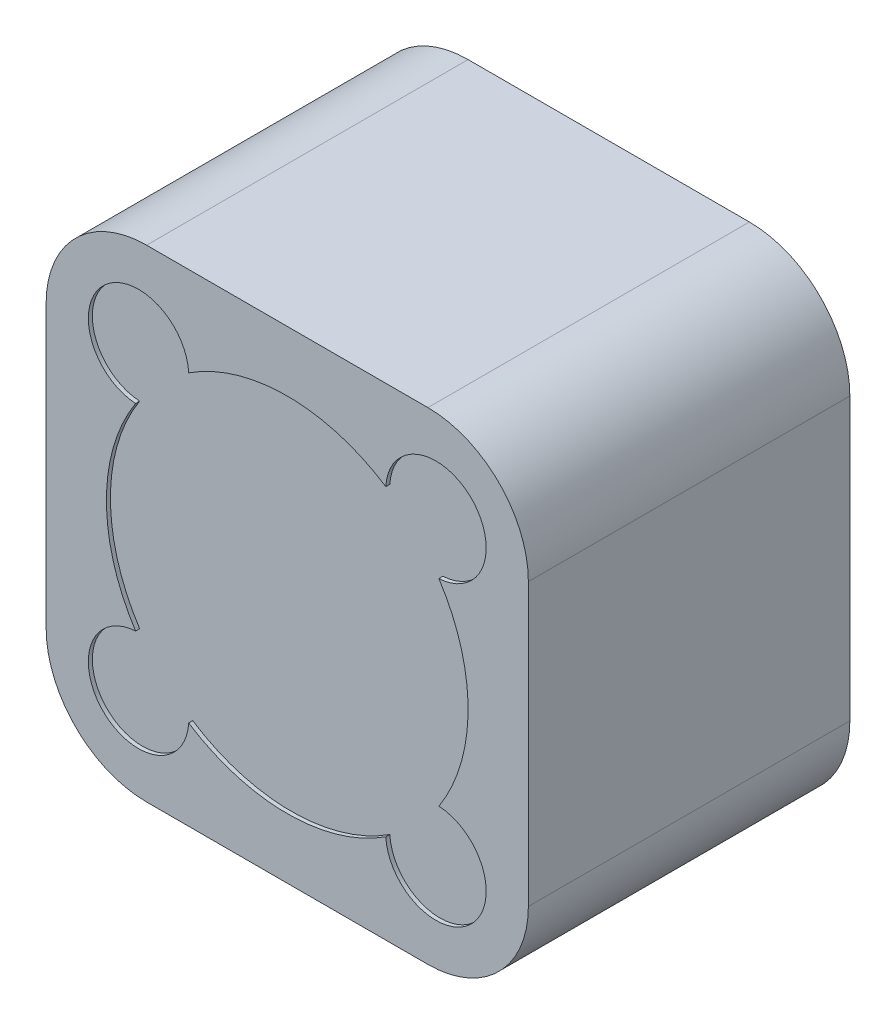
ISO-10303-21;
HEADER;
FILE_DESCRIPTION(('STEP AP214'),'2;1');
FILE_NAME('part.step','',(''),(''),'','','');
FILE_SCHEMA(('AUTOMOTIVE_DESIGN { 1 0 10303 214 1 1 1 1 }'));
ENDSEC;
DATA;
#1=APPLICATION_CONTEXT('core data for automotive mechanical design processes');
#2=APPLICATION_PROTOCOL_DEFINITION('international standard','automotive_design',2000,#1);
#3=PRODUCT_CONTEXT('',#1,'mechanical');
#4=PRODUCT('Part','Part','',(#3));
#5=PRODUCT_RELATED_PRODUCT_CATEGORY('part','',(#4));
#6=PRODUCT_DEFINITION_FORMATION('','',#4);
#7=PRODUCT_DEFINITION_CONTEXT('part definition',#1,'design');
#8=PRODUCT_DEFINITION('design','',#6,#7);
#9=PRODUCT_DEFINITION_SHAPE('','',#8);
#10=(LENGTH_UNIT() NAMED_UNIT(*) SI_UNIT(.MILLI.,.METRE.));
#11=(NAMED_UNIT(*) PLANE_ANGLE_UNIT() SI_UNIT($,.RADIAN.));
#12=(NAMED_UNIT(*) SI_UNIT($,.STERADIAN.) SOLID_ANGLE_UNIT());
#13=UNCERTAINTY_MEASURE_WITH_UNIT(LENGTH_MEASURE(1.E-05),#10,'distance_accuracy_value','');
#14=(GEOMETRIC_REPRESENTATION_CONTEXT(3) GLOBAL_UNCERTAINTY_ASSIGNED_CONTEXT((#13)) GLOBAL_UNIT_ASSIGNED_CONTEXT((#10,
#11,#12)) REPRESENTATION_CONTEXT('',''));
#15=CARTESIAN_POINT('',(0.,0.,0.));
#16=DIRECTION('',(0.,0.,1.));
#17=DIRECTION('',(1.,0.,0.));
#18=AXIS2_PLACEMENT_3D('',#15,#16,#17);
#19=CARTESIAN_POINT('',(0.,0.,7.9));
#20=DIRECTION('',(0.,0.,1.));
#21=DIRECTION('',(1.,0.,0.));
#22=AXIS2_PLACEMENT_3D('',#19,#20,#21);
#23=CYLINDRICAL_SURFACE('',#22,4.5);
#24=CARTESIAN_POINT('',(0.,0.,7.9));
#25=DIRECTION('',(0.,0.,1.));
#26=DIRECTION('',(1.,0.,0.));
#27=AXIS2_PLACEMENT_3D('',#24,#25,#26);
#28=CIRCLE('',#27,4.5);
#29=CARTESIAN_POINT('',(3.77319310560411,-2.45214473223372,7.9));
#30=VERTEX_POINT('',#29);
#31=CARTESIAN_POINT('',(3.77319310560411,2.45214473223373,7.9));
#32=VERTEX_POINT('',#31);
#33=EDGE_CURVE('E165',#30,#32,#28,.T.);
#34=ORIENTED_EDGE('',*,*,#33,.F.);
#35=DIRECTION('',(0.,0.,1.));
#36=VECTOR('',#35,1.);
#37=CARTESIAN_POINT('',(3.77319310560411,-2.45214473223372,7.95));
#38=LINE('',#37,#36);
#39=CARTESIAN_POINT('',(3.77319310560411,-2.45214473223372,8.));
#40=VERTEX_POINT('',#39);
#41=EDGE_CURVE('E313',#30,#40,#38,.T.);
#42=ORIENTED_EDGE('',*,*,#41,.T.);
#43=CARTESIAN_POINT('',(0.,0.,8.));
#44=DIRECTION('',(0.,0.,1.));
#45=DIRECTION('',(1.,0.,0.));
#46=AXIS2_PLACEMENT_3D('',#43,#44,#45);
#47=CIRCLE('',#46,4.5);
#48=CARTESIAN_POINT('',(3.77319310560411,2.45214473223373,8.));
#49=VERTEX_POINT('',#48);
#50=EDGE_CURVE('E177',#40,#49,#47,.T.);
#51=ORIENTED_EDGE('',*,*,#50,.T.);
#52=DIRECTION('',(0.,0.,1.));
#53=VECTOR('',#52,1.);
#54=CARTESIAN_POINT('',(3.77319310560411,2.45214473223373,7.95));
#55=LINE('',#54,#53);
#56=EDGE_CURVE('E323',#49,#32,#55,.F.);
#57=ORIENTED_EDGE('',*,*,#56,.T.);
#58=EDGE_LOOP('',(#34,#42,#51,#57));
#59=FACE_BOUND('',#58,.T.);
#60=ADVANCED_FACE('F33',(#59),#23,.F.);
#61=CARTESIAN_POINT('',(2.45214473223373,3.77319310560411,7.9));
#62=VERTEX_POINT('',#61);
#63=CARTESIAN_POINT('',(-2.45214473223377,3.77319310560408,7.9));
#64=VERTEX_POINT('',#63);
#65=EDGE_CURVE('E158',#62,#64,#28,.T.);
#66=ORIENTED_EDGE('',*,*,#65,.F.);
#67=DIRECTION('',(0.,0.,1.));
#68=VECTOR('',#67,1.);
#69=CARTESIAN_POINT('',(2.45214473223373,3.77319310560411,7.95));
#70=LINE('',#69,#68);
#71=CARTESIAN_POINT('',(2.45214473223373,3.77319310560411,8.));
#72=VERTEX_POINT('',#71);
#73=EDGE_CURVE('E321',#62,#72,#70,.T.);
#74=ORIENTED_EDGE('',*,*,#73,.T.);
#75=CARTESIAN_POINT('',(-2.45214473223377,3.77319310560408,8.));
#76=VERTEX_POINT('',#75);
#77=EDGE_CURVE('E160',#72,#76,#47,.T.);
#78=ORIENTED_EDGE('',*,*,#77,.T.);
#79=DIRECTION('',(0.,0.,1.));
#80=VECTOR('',#79,1.);
#81=CARTESIAN_POINT('',(-2.45214473223377,3.77319310560408,7.95));
#82=LINE('',#81,#80);
#83=EDGE_CURVE('E145',#76,#64,#82,.F.);
#84=ORIENTED_EDGE('',*,*,#83,.T.);
#85=EDGE_LOOP('',(#66,#74,#78,#84));
#86=FACE_BOUND('',#85,.T.);
#87=ADVANCED_FACE('F156',(#86),#23,.F.);
#88=CARTESIAN_POINT('',(-3.77319310560413,2.45214473223369,7.9));
#89=VERTEX_POINT('',#88);
#90=CARTESIAN_POINT('',(-3.77319310560411,-2.45214473223373,7.9));
#91=VERTEX_POINT('',#90);
#92=EDGE_CURVE('E166',#89,#91,#28,.T.);
#93=ORIENTED_EDGE('',*,*,#92,.F.);
#94=DIRECTION('',(0.,0.,1.));
#95=VECTOR('',#94,1.);
#96=CARTESIAN_POINT('',(-3.77319310560413,2.45214473223369,7.95));
#97=LINE('',#96,#95);
#98=CARTESIAN_POINT('',(-3.77319310560413,2.45214473223369,8.));
#99=VERTEX_POINT('',#98);
#100=EDGE_CURVE('E148',#89,#99,#97,.T.);
#101=ORIENTED_EDGE('',*,*,#100,.T.);
#102=CARTESIAN_POINT('',(-3.77319310560411,-2.45214473223373,8.));
#103=VERTEX_POINT('',#102);
#104=EDGE_CURVE('E178',#99,#103,#47,.T.);
#105=ORIENTED_EDGE('',*,*,#104,.T.);
#106=DIRECTION('',(0.,0.,1.));
#107=VECTOR('',#106,1.);
#108=CARTESIAN_POINT('',(-3.77319310560411,-2.45214473223373,7.95));
#109=LINE('',#108,#107);
#110=EDGE_CURVE('E303',#103,#91,#109,.F.);
#111=ORIENTED_EDGE('',*,*,#110,.T.);
#112=EDGE_LOOP('',(#93,#101,#105,#111));
#113=FACE_BOUND('',#112,.T.);
#114=ADVANCED_FACE('F284',(#113),#23,.F.);
#115=CARTESIAN_POINT('',(6.,-6.,8.));
#116=DIRECTION('',(-1.,0.,0.));
#117=DIRECTION('',(0.,0.,1.));
#118=AXIS2_PLACEMENT_3D('',#115,#116,#117);
#119=PLANE('',#118);
#120=DIRECTION('',(0.,1.,0.));
#121=VECTOR('',#120,1.);
#122=CARTESIAN_POINT('',(6.,-6.,0.));
#123=LINE('',#122,#121);
#124=CARTESIAN_POINT('',(6.,-3.5,0.));
#125=VERTEX_POINT('',#124);
#126=CARTESIAN_POINT('',(6.,3.5,0.));
#127=VERTEX_POINT('',#126);
#128=EDGE_CURVE('E172',#125,#127,#123,.T.);
#129=ORIENTED_EDGE('',*,*,#128,.T.);
#130=DIRECTION('',(0.,0.,-1.));
#131=VECTOR('',#130,1.);
#132=CARTESIAN_POINT('',(6.,3.5,8.));
#133=LINE('',#132,#131);
#134=CARTESIAN_POINT('',(6.,3.5,8.));
#135=VERTEX_POINT('',#134);
#136=EDGE_CURVE('E231',#127,#135,#133,.F.);
#137=ORIENTED_EDGE('',*,*,#136,.T.);
#138=DIRECTION('',(0.,1.,0.));
#139=VECTOR('',#138,1.);
#140=CARTESIAN_POINT('',(6.,-6.,8.));
#141=LINE('',#140,#139);
#142=CARTESIAN_POINT('',(6.,-3.5,8.));
#143=VERTEX_POINT('',#142);
#144=EDGE_CURVE('E179',#143,#135,#141,.T.);
#145=ORIENTED_EDGE('',*,*,#144,.F.);
#146=DIRECTION('',(0.,0.,-1.));
#147=VECTOR('',#146,1.);
#148=CARTESIAN_POINT('',(6.,-3.5,8.));
#149=LINE('',#148,#147);
#150=EDGE_CURVE('E228',#143,#125,#149,.T.);
#151=ORIENTED_EDGE('',*,*,#150,.T.);
#152=EDGE_LOOP('',(#129,#137,#145,#151));
#153=FACE_BOUND('',#152,.T.);
#154=ADVANCED_FACE('F247',(#153),#119,.F.);
#155=CARTESIAN_POINT('',(-6.,6.,8.));
#156=DIRECTION('',(0.,-1.,0.));
#157=DIRECTION('',(0.,0.,-1.));
#158=AXIS2_PLACEMENT_3D('',#155,#156,#157);
#159=PLANE('',#158);
#160=DIRECTION('',(-1.,0.,0.));
#161=VECTOR('',#160,1.);
#162=CARTESIAN_POINT('',(-6.,6.,0.));
#163=LINE('',#162,#161);
#164=CARTESIAN_POINT('',(3.5,6.,0.));
#165=VERTEX_POINT('',#164);
#166=CARTESIAN_POINT('',(-3.5,6.,0.));
#167=VERTEX_POINT('',#166);
#168=EDGE_CURVE('E195',#165,#167,#163,.T.);
#169=ORIENTED_EDGE('',*,*,#168,.T.);
#170=DIRECTION('',(0.,0.,-1.));
#171=VECTOR('',#170,1.);
#172=CARTESIAN_POINT('',(-3.5,6.,8.));
#173=LINE('',#172,#171);
#174=CARTESIAN_POINT('',(-3.5,6.,8.));
#175=VERTEX_POINT('',#174);
#176=EDGE_CURVE('E218',#167,#175,#173,.F.);
#177=ORIENTED_EDGE('',*,*,#176,.T.);
#178=DIRECTION('',(-1.,0.,0.));
#179=VECTOR('',#178,1.);
#180=CARTESIAN_POINT('',(-6.,6.,8.));
#181=LINE('',#180,#179);
#182=CARTESIAN_POINT('',(3.5,6.,8.));
#183=VERTEX_POINT('',#182);
#184=EDGE_CURVE('E182',#183,#175,#181,.T.);
#185=ORIENTED_EDGE('',*,*,#184,.F.);
#186=DIRECTION('',(0.,0.,-1.));
#187=VECTOR('',#186,1.);
#188=CARTESIAN_POINT('',(3.5,6.,8.));
#189=LINE('',#188,#187);
#190=EDGE_CURVE('E215',#183,#165,#189,.T.);
#191=ORIENTED_EDGE('',*,*,#190,.T.);
#192=EDGE_LOOP('',(#169,#177,#185,#191));
#193=FACE_BOUND('',#192,.T.);
#194=ADVANCED_FACE('F259',(#193),#159,.F.);
#195=CARTESIAN_POINT('',(-6.,-6.,8.));
#196=DIRECTION('',(1.,0.,0.));
#197=DIRECTION('',(0.,0.,-1.));
#198=AXIS2_PLACEMENT_3D('',#195,#196,#197);
#199=PLANE('',#198);
#200=DIRECTION('',(0.,-1.,0.));
#201=VECTOR('',#200,1.);
#202=CARTESIAN_POINT('',(-6.,-6.,8.));
#203=LINE('',#202,#201);
#204=CARTESIAN_POINT('',(-6.,3.5,8.));
#205=VERTEX_POINT('',#204);
#206=CARTESIAN_POINT('',(-6.,-3.5,8.));
#207=VERTEX_POINT('',#206);
#208=EDGE_CURVE('E186',#205,#207,#203,.T.);
#209=ORIENTED_EDGE('',*,*,#208,.F.);
#210=DIRECTION('',(0.,0.,-1.));
#211=VECTOR('',#210,1.);
#212=CARTESIAN_POINT('',(-6.,3.5,8.));
#213=LINE('',#212,#211);
#214=CARTESIAN_POINT('',(-6.,3.5,0.));
#215=VERTEX_POINT('',#214);
#216=EDGE_CURVE('E204',#205,#215,#213,.T.);
#217=ORIENTED_EDGE('',*,*,#216,.T.);
#218=DIRECTION('',(0.,-1.,0.));
#219=VECTOR('',#218,1.);
#220=CARTESIAN_POINT('',(-6.,-6.,0.));
#221=LINE('',#220,#219);
#222=CARTESIAN_POINT('',(-6.,-3.5,0.));
#223=VERTEX_POINT('',#222);
#224=EDGE_CURVE('E198',#215,#223,#221,.T.);
#225=ORIENTED_EDGE('',*,*,#224,.T.);
#226=DIRECTION('',(0.,0.,-1.));
#227=VECTOR('',#226,1.);
#228=CARTESIAN_POINT('',(-6.,-3.5,8.));
#229=LINE('',#228,#227);
#230=EDGE_CURVE('E192',#223,#207,#229,.F.);
#231=ORIENTED_EDGE('',*,*,#230,.T.);
#232=EDGE_LOOP('',(#209,#217,#225,#231));
#233=FACE_BOUND('',#232,.T.);
#234=ADVANCED_FACE('F267',(#233),#199,.F.);
#235=CARTESIAN_POINT('',(-6.,-6.,8.));
#236=DIRECTION('',(0.,1.,0.));
#237=DIRECTION('',(0.,0.,1.));
#238=AXIS2_PLACEMENT_3D('',#235,#236,#237);
#239=PLANE('',#238);
#240=DIRECTION('',(1.,0.,0.));
#241=VECTOR('',#240,1.);
#242=CARTESIAN_POINT('',(-6.,-6.,8.));
#243=LINE('',#242,#241);
#244=CARTESIAN_POINT('',(-3.5,-6.,8.));
#245=VERTEX_POINT('',#244);
#246=CARTESIAN_POINT('',(3.5,-6.,8.));
#247=VERTEX_POINT('',#246);
#248=EDGE_CURVE('E189',#245,#247,#243,.T.);
#249=ORIENTED_EDGE('',*,*,#248,.F.);
#250=DIRECTION('',(0.,0.,-1.));
#251=VECTOR('',#250,1.);
#252=CARTESIAN_POINT('',(-3.5,-6.,8.));
#253=LINE('',#252,#251);
#254=CARTESIAN_POINT('',(-3.5,-6.,0.));
#255=VERTEX_POINT('',#254);
#256=EDGE_CURVE('E11',#245,#255,#253,.T.);
#257=ORIENTED_EDGE('',*,*,#256,.T.);
#258=DIRECTION('',(1.,0.,0.));
#259=VECTOR('',#258,1.);
#260=CARTESIAN_POINT('',(-6.,-6.,0.));
#261=LINE('',#260,#259);
#262=CARTESIAN_POINT('',(3.5,-6.,0.));
#263=VERTEX_POINT('',#262);
#264=EDGE_CURVE('E183',#255,#263,#261,.T.);
#265=ORIENTED_EDGE('',*,*,#264,.T.);
#266=DIRECTION('',(0.,0.,-1.));
#267=VECTOR('',#266,1.);
#268=CARTESIAN_POINT('',(3.5,-6.,8.));
#269=LINE('',#268,#267);
#270=EDGE_CURVE('E41',#263,#247,#269,.F.);
#271=ORIENTED_EDGE('',*,*,#270,.T.);
#272=EDGE_LOOP('',(#249,#257,#265,#271));
#273=FACE_BOUND('',#272,.T.);
#274=ADVANCED_FACE('F235',(#273),#239,.F.);
#275=CARTESIAN_POINT('',(0.,0.,8.));
#276=DIRECTION('',(0.,0.,-1.));
#277=DIRECTION('',(-1.,0.,0.));
#278=AXIS2_PLACEMENT_3D('',#275,#276,#277);
#279=PLANE('',#278);
#280=ORIENTED_EDGE('',*,*,#50,.F.);
#281=CARTESIAN_POINT('',(3.70000000000001,-3.69999999999999,8.));
#282=DIRECTION('',(0.,0.,1.));
#283=DIRECTION('',(0.,1.,0.));
#284=AXIS2_PLACEMENT_3D('',#281,#282,#283);
#285=CIRCLE('',#284,1.25);
#286=CARTESIAN_POINT('',(2.45214473223374,-3.7731931056041,8.));
#287=VERTEX_POINT('',#286);
#288=EDGE_CURVE('E330',#287,#40,#285,.T.);
#289=ORIENTED_EDGE('',*,*,#288,.F.);
#290=CARTESIAN_POINT('',(-2.45214473223373,-3.77319310560411,8.));
#291=VERTEX_POINT('',#290);
#292=EDGE_CURVE('E169',#291,#287,#47,.T.);
#293=ORIENTED_EDGE('',*,*,#292,.F.);
#294=CARTESIAN_POINT('',(-3.7,-3.7,8.));
#295=DIRECTION('',(0.,0.,1.));
#296=DIRECTION('',(1.,0.,0.));
#297=AXIS2_PLACEMENT_3D('',#294,#295,#296);
#298=CIRCLE('',#297,1.25);
#299=EDGE_CURVE('E311',#103,#291,#298,.T.);
#300=ORIENTED_EDGE('',*,*,#299,.F.);
#301=ORIENTED_EDGE('',*,*,#104,.F.);
#302=CARTESIAN_POINT('',(-3.70000000000004,3.69999999999996,8.));
#303=DIRECTION('',(0.,0.,1.));
#304=DIRECTION('',(0.,-1.,0.));
#305=AXIS2_PLACEMENT_3D('',#302,#303,#304);
#306=CIRCLE('',#305,1.25);
#307=EDGE_CURVE('E151',#76,#99,#306,.T.);
#308=ORIENTED_EDGE('',*,*,#307,.F.);
#309=ORIENTED_EDGE('',*,*,#77,.F.);
#310=CARTESIAN_POINT('',(3.7,3.7,8.));
#311=DIRECTION('',(0.,0.,1.));
#312=DIRECTION('',(-1.,0.,0.));
#313=AXIS2_PLACEMENT_3D('',#310,#311,#312);
#314=CIRCLE('',#313,1.25);
#315=EDGE_CURVE('E150',#49,#72,#314,.T.);
#316=ORIENTED_EDGE('',*,*,#315,.F.);
#317=EDGE_LOOP('',(#280,#289,#293,#300,#301,#308,#309,#316));
#318=FACE_BOUND('',#317,.T.);
#319=ORIENTED_EDGE('',*,*,#184,.T.);
#320=CARTESIAN_POINT('',(-3.5,3.5,8.));
#321=DIRECTION('',(0.,0.,-1.));
#322=DIRECTION('',(-1.,0.,0.));
#323=AXIS2_PLACEMENT_3D('',#320,#321,#322);
#324=CIRCLE('',#323,2.5);
#325=EDGE_CURVE('E226',#175,#205,#324,.F.);
#326=ORIENTED_EDGE('',*,*,#325,.T.);
#327=ORIENTED_EDGE('',*,*,#208,.T.);
#328=CARTESIAN_POINT('',(-3.5,-3.5,8.));
#329=DIRECTION('',(0.,0.,-1.));
#330=DIRECTION('',(-1.,0.,0.));
#331=AXIS2_PLACEMENT_3D('',#328,#329,#330);
#332=CIRCLE('',#331,2.5);
#333=EDGE_CURVE('E222',#207,#245,#332,.F.);
#334=ORIENTED_EDGE('',*,*,#333,.T.);
#335=ORIENTED_EDGE('',*,*,#248,.T.);
#336=CARTESIAN_POINT('',(3.5,-3.5,8.));
#337=DIRECTION('',(0.,0.,-1.));
#338=DIRECTION('',(-1.,0.,0.));
#339=AXIS2_PLACEMENT_3D('',#336,#337,#338);
#340=CIRCLE('',#339,2.5);
#341=EDGE_CURVE('E220',#247,#143,#340,.F.);
#342=ORIENTED_EDGE('',*,*,#341,.T.);
#343=ORIENTED_EDGE('',*,*,#144,.T.);
#344=CARTESIAN_POINT('',(3.5,3.5,8.));
#345=DIRECTION('',(0.,0.,-1.));
#346=DIRECTION('',(-1.,0.,0.));
#347=AXIS2_PLACEMENT_3D('',#344,#345,#346);
#348=CIRCLE('',#347,2.5);
#349=EDGE_CURVE('E224',#135,#183,#348,.F.);
#350=ORIENTED_EDGE('',*,*,#349,.T.);
#351=EDGE_LOOP('',(#319,#326,#327,#334,#335,#342,#343,#350));
#352=FACE_BOUND('',#351,.T.);
#353=ADVANCED_FACE('F241',(#318,#352),#279,.F.);
#354=CARTESIAN_POINT('',(0.,0.,0.));
#355=DIRECTION('',(0.,0.,-1.));
#356=DIRECTION('',(-1.,0.,0.));
#357=AXIS2_PLACEMENT_3D('',#354,#355,#356);
#358=PLANE('',#357);
#359=ORIENTED_EDGE('',*,*,#224,.F.);
#360=CARTESIAN_POINT('',(-3.5,3.5,0.));
#361=DIRECTION('',(0.,0.,-1.));
#362=DIRECTION('',(-1.,0.,0.));
#363=AXIS2_PLACEMENT_3D('',#360,#361,#362);
#364=CIRCLE('',#363,2.5);
#365=EDGE_CURVE('E213',#215,#167,#364,.T.);
#366=ORIENTED_EDGE('',*,*,#365,.T.);
#367=ORIENTED_EDGE('',*,*,#168,.F.);
#368=CARTESIAN_POINT('',(3.5,3.5,0.));
#369=DIRECTION('',(0.,0.,-1.));
#370=DIRECTION('',(-1.,0.,0.));
#371=AXIS2_PLACEMENT_3D('',#368,#369,#370);
#372=CIRCLE('',#371,2.5);
#373=EDGE_CURVE('E211',#165,#127,#372,.T.);
#374=ORIENTED_EDGE('',*,*,#373,.T.);
#375=ORIENTED_EDGE('',*,*,#128,.F.);
#376=CARTESIAN_POINT('',(3.5,-3.5,0.));
#377=DIRECTION('',(0.,0.,-1.));
#378=DIRECTION('',(-1.,0.,0.));
#379=AXIS2_PLACEMENT_3D('',#376,#377,#378);
#380=CIRCLE('',#379,2.5);
#381=EDGE_CURVE('E207',#125,#263,#380,.T.);
#382=ORIENTED_EDGE('',*,*,#381,.T.);
#383=ORIENTED_EDGE('',*,*,#264,.F.);
#384=CARTESIAN_POINT('',(-3.5,-3.5,0.));
#385=DIRECTION('',(0.,0.,-1.));
#386=DIRECTION('',(-1.,0.,0.));
#387=AXIS2_PLACEMENT_3D('',#384,#385,#386);
#388=CIRCLE('',#387,2.5);
#389=EDGE_CURVE('E209',#255,#223,#388,.T.);
#390=ORIENTED_EDGE('',*,*,#389,.T.);
#391=EDGE_LOOP('',(#359,#366,#367,#374,#375,#382,#383,#390));
#392=FACE_BOUND('',#391,.T.);
#393=ADVANCED_FACE('F251',(#392),#358,.T.);
#394=CARTESIAN_POINT('',(-3.5,3.5,8.));
#395=DIRECTION('',(0.,0.,-1.));
#396=DIRECTION('',(-1.,0.,0.));
#397=AXIS2_PLACEMENT_3D('',#394,#395,#396);
#398=CYLINDRICAL_SURFACE('',#397,2.5);
#399=ORIENTED_EDGE('',*,*,#325,.F.);
#400=ORIENTED_EDGE('',*,*,#176,.F.);
#401=ORIENTED_EDGE('',*,*,#365,.F.);
#402=ORIENTED_EDGE('',*,*,#216,.F.);
#403=EDGE_LOOP('',(#399,#400,#401,#402));
#404=FACE_BOUND('',#403,.T.);
#405=ADVANCED_FACE('F265',(#404),#398,.T.);
#406=CARTESIAN_POINT('',(3.5,3.5,8.));
#407=DIRECTION('',(0.,0.,-1.));
#408=DIRECTION('',(-1.,0.,0.));
#409=AXIS2_PLACEMENT_3D('',#406,#407,#408);
#410=CYLINDRICAL_SURFACE('',#409,2.5);
#411=ORIENTED_EDGE('',*,*,#349,.F.);
#412=ORIENTED_EDGE('',*,*,#136,.F.);
#413=ORIENTED_EDGE('',*,*,#373,.F.);
#414=ORIENTED_EDGE('',*,*,#190,.F.);
#415=EDGE_LOOP('',(#411,#412,#413,#414));
#416=FACE_BOUND('',#415,.T.);
#417=ADVANCED_FACE('F256',(#416),#410,.T.);
#418=CARTESIAN_POINT('',(-3.5,-3.5,8.));
#419=DIRECTION('',(0.,0.,-1.));
#420=DIRECTION('',(-1.,0.,0.));
#421=AXIS2_PLACEMENT_3D('',#418,#419,#420);
#422=CYLINDRICAL_SURFACE('',#421,2.5);
#423=ORIENTED_EDGE('',*,*,#333,.F.);
#424=ORIENTED_EDGE('',*,*,#230,.F.);
#425=ORIENTED_EDGE('',*,*,#389,.F.);
#426=ORIENTED_EDGE('',*,*,#256,.F.);
#427=EDGE_LOOP('',(#423,#424,#425,#426));
#428=FACE_BOUND('',#427,.T.);
#429=ADVANCED_FACE('F270',(#428),#422,.T.);
#430=CARTESIAN_POINT('',(3.5,-3.5,8.));
#431=DIRECTION('',(0.,0.,-1.));
#432=DIRECTION('',(-1.,0.,0.));
#433=AXIS2_PLACEMENT_3D('',#430,#431,#432);
#434=CYLINDRICAL_SURFACE('',#433,2.5);
#435=ORIENTED_EDGE('',*,*,#341,.F.);
#436=ORIENTED_EDGE('',*,*,#270,.F.);
#437=ORIENTED_EDGE('',*,*,#381,.F.);
#438=ORIENTED_EDGE('',*,*,#150,.F.);
#439=EDGE_LOOP('',(#435,#436,#437,#438));
#440=FACE_BOUND('',#439,.T.);
#441=ADVANCED_FACE('F35',(#440),#434,.T.);
#442=ORIENTED_EDGE('',*,*,#292,.T.);
#443=DIRECTION('',(0.,0.,1.));
#444=VECTOR('',#443,1.);
#445=CARTESIAN_POINT('',(2.45214473223374,-3.7731931056041,7.95));
#446=LINE('',#445,#444);
#447=CARTESIAN_POINT('',(2.45214473223374,-3.7731931056041,7.9));
#448=VERTEX_POINT('',#447);
#449=EDGE_CURVE('E318',#287,#448,#446,.F.);
#450=ORIENTED_EDGE('',*,*,#449,.T.);
#451=CARTESIAN_POINT('',(-2.45214473223373,-3.77319310560411,7.9));
#452=VERTEX_POINT('',#451);
#453=EDGE_CURVE('E168',#452,#448,#28,.T.);
#454=ORIENTED_EDGE('',*,*,#453,.F.);
#455=DIRECTION('',(0.,0.,1.));
#456=VECTOR('',#455,1.);
#457=CARTESIAN_POINT('',(-2.45214473223373,-3.77319310560411,7.95));
#458=LINE('',#457,#456);
#459=EDGE_CURVE('E173',#452,#291,#458,.T.);
#460=ORIENTED_EDGE('',*,*,#459,.T.);
#461=EDGE_LOOP('',(#442,#450,#454,#460));
#462=FACE_BOUND('',#461,.T.);
#463=ADVANCED_FACE('F276',(#462),#23,.F.);
#464=CARTESIAN_POINT('',(0.,0.,7.9));
#465=DIRECTION('',(0.,0.,1.));
#466=DIRECTION('',(1.,0.,0.));
#467=AXIS2_PLACEMENT_3D('',#464,#465,#466);
#468=PLANE('',#467);
#469=ORIENTED_EDGE('',*,*,#453,.T.);
#470=CARTESIAN_POINT('',(3.70000000000001,-3.69999999999999,7.9));
#471=DIRECTION('',(0.,0.,1.));
#472=DIRECTION('',(0.,1.,0.));
#473=AXIS2_PLACEMENT_3D('',#470,#471,#472);
#474=CIRCLE('',#473,1.25);
#475=EDGE_CURVE('E161',#448,#30,#474,.T.);
#476=ORIENTED_EDGE('',*,*,#475,.T.);
#477=ORIENTED_EDGE('',*,*,#33,.T.);
#478=CARTESIAN_POINT('',(3.7,3.7,7.9));
#479=DIRECTION('',(0.,0.,1.));
#480=DIRECTION('',(-1.,0.,0.));
#481=AXIS2_PLACEMENT_3D('',#478,#479,#480);
#482=CIRCLE('',#481,1.25);
#483=EDGE_CURVE('E54',#32,#62,#482,.T.);
#484=ORIENTED_EDGE('',*,*,#483,.T.);
#485=ORIENTED_EDGE('',*,*,#65,.T.);
#486=CARTESIAN_POINT('',(-3.70000000000004,3.69999999999996,7.9));
#487=DIRECTION('',(0.,0.,1.));
#488=DIRECTION('',(0.,-1.,0.));
#489=AXIS2_PLACEMENT_3D('',#486,#487,#488);
#490=CIRCLE('',#489,1.25);
#491=EDGE_CURVE('E48',#64,#89,#490,.T.);
#492=ORIENTED_EDGE('',*,*,#491,.T.);
#493=ORIENTED_EDGE('',*,*,#92,.T.);
#494=CARTESIAN_POINT('',(-3.7,-3.7,7.9));
#495=DIRECTION('',(0.,0.,1.));
#496=DIRECTION('',(1.,0.,0.));
#497=AXIS2_PLACEMENT_3D('',#494,#495,#496);
#498=CIRCLE('',#497,1.25);
#499=EDGE_CURVE('E305',#91,#452,#498,.T.);
#500=ORIENTED_EDGE('',*,*,#499,.T.);
#501=EDGE_LOOP('',(#469,#476,#477,#484,#485,#492,#493,#500));
#502=FACE_BOUND('',#501,.T.);
#503=ADVANCED_FACE('F164',(#502),#468,.T.);
#504=CARTESIAN_POINT('',(-3.7,-3.7,7.9));
#505=DIRECTION('',(0.,0.,1.));
#506=DIRECTION('',(1.,0.,0.));
#507=AXIS2_PLACEMENT_3D('',#504,#505,#506);
#508=CYLINDRICAL_SURFACE('',#507,1.25);
#509=ORIENTED_EDGE('',*,*,#499,.F.);
#510=ORIENTED_EDGE('',*,*,#110,.F.);
#511=ORIENTED_EDGE('',*,*,#299,.T.);
#512=ORIENTED_EDGE('',*,*,#459,.F.);
#513=EDGE_LOOP('',(#509,#510,#511,#512));
#514=FACE_BOUND('',#513,.T.);
#515=ADVANCED_FACE('F293',(#514),#508,.F.);
#516=CARTESIAN_POINT('',(-3.70000000000004,3.69999999999996,7.9));
#517=DIRECTION('',(0.,0.,1.));
#518=DIRECTION('',(1.,0.,0.));
#519=AXIS2_PLACEMENT_3D('',#516,#517,#518);
#520=CYLINDRICAL_SURFACE('',#519,1.25);
#521=ORIENTED_EDGE('',*,*,#491,.F.);
#522=ORIENTED_EDGE('',*,*,#83,.F.);
#523=ORIENTED_EDGE('',*,*,#307,.T.);
#524=ORIENTED_EDGE('',*,*,#100,.F.);
#525=EDGE_LOOP('',(#521,#522,#523,#524));
#526=FACE_BOUND('',#525,.T.);
#527=ADVANCED_FACE('F144',(#526),#520,.F.);
#528=CARTESIAN_POINT('',(3.7,3.7,7.9));
#529=DIRECTION('',(0.,0.,1.));
#530=DIRECTION('',(1.,0.,0.));
#531=AXIS2_PLACEMENT_3D('',#528,#529,#530);
#532=CYLINDRICAL_SURFACE('',#531,1.25);
#533=ORIENTED_EDGE('',*,*,#483,.F.);
#534=ORIENTED_EDGE('',*,*,#56,.F.);
#535=ORIENTED_EDGE('',*,*,#315,.T.);
#536=ORIENTED_EDGE('',*,*,#73,.F.);
#537=EDGE_LOOP('',(#533,#534,#535,#536));
#538=FACE_BOUND('',#537,.T.);
#539=ADVANCED_FACE('F340',(#538),#532,.F.);
#540=CARTESIAN_POINT('',(3.70000000000001,-3.69999999999999,7.9));
#541=DIRECTION('',(0.,0.,1.));
#542=DIRECTION('',(1.,0.,0.));
#543=AXIS2_PLACEMENT_3D('',#540,#541,#542);
#544=CYLINDRICAL_SURFACE('',#543,1.25);
#545=ORIENTED_EDGE('',*,*,#475,.F.);
#546=ORIENTED_EDGE('',*,*,#449,.F.);
#547=ORIENTED_EDGE('',*,*,#288,.T.);
#548=ORIENTED_EDGE('',*,*,#41,.F.);
#549=EDGE_LOOP('',(#545,#546,#547,#548));
#550=FACE_BOUND('',#549,.T.);
#551=ADVANCED_FACE('F334',(#550),#544,.F.);
#552=CLOSED_SHELL('',(#60,#87,#114,#154,#194,#234,#274,#353,#393,#405,#417,#429,#441,#463,#503,
#515,#527,#539,#551));
#553=MANIFOLD_SOLID_BREP('B2',#552);
#554=ADVANCED_BREP_SHAPE_REPRESENTATION('',(#18,#553),#14);
#555=SHAPE_DEFINITION_REPRESENTATION(#9,#554);
ENDSEC;
END-ISO-10303-21;
